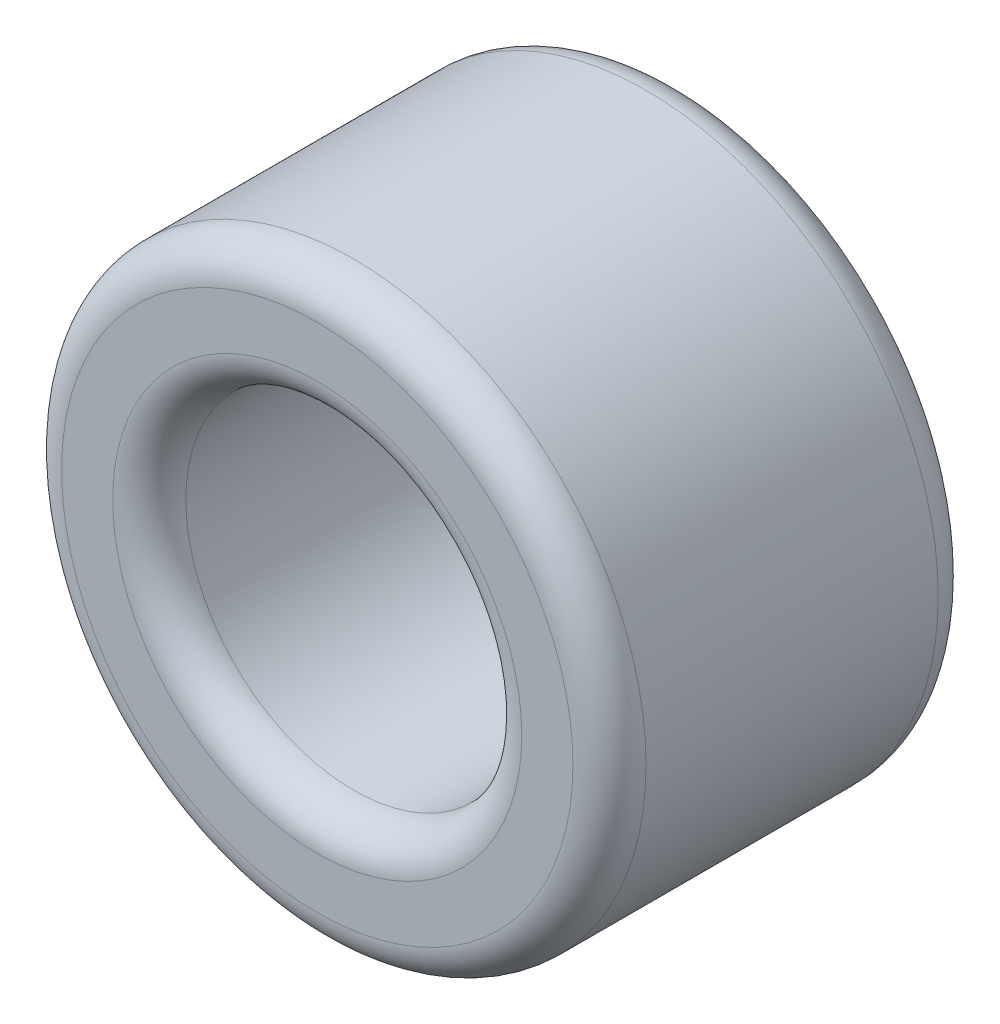
ISO-10303-21;
HEADER;
FILE_DESCRIPTION(('STEP AP214'),'2;1');
FILE_NAME('part.step','',(''),(''),'','','');
FILE_SCHEMA(('AUTOMOTIVE_DESIGN { 1 0 10303 214 1 1 1 1 }'));
ENDSEC;
DATA;
#1=APPLICATION_CONTEXT('core data for automotive mechanical design processes');
#2=APPLICATION_PROTOCOL_DEFINITION('international standard','automotive_design',2000,#1);
#3=PRODUCT_CONTEXT('',#1,'mechanical');
#4=PRODUCT('Part','Part','',(#3));
#5=PRODUCT_RELATED_PRODUCT_CATEGORY('part','',(#4));
#6=PRODUCT_DEFINITION_FORMATION('','',#4);
#7=PRODUCT_DEFINITION_CONTEXT('part definition',#1,'design');
#8=PRODUCT_DEFINITION('design','',#6,#7);
#9=PRODUCT_DEFINITION_SHAPE('','',#8);
#10=(LENGTH_UNIT() NAMED_UNIT(*) SI_UNIT(.MILLI.,.METRE.));
#11=(NAMED_UNIT(*) PLANE_ANGLE_UNIT() SI_UNIT($,.RADIAN.));
#12=(NAMED_UNIT(*) SI_UNIT($,.STERADIAN.) SOLID_ANGLE_UNIT());
#13=UNCERTAINTY_MEASURE_WITH_UNIT(LENGTH_MEASURE(1.E-05),#10,'distance_accuracy_value','');
#14=(GEOMETRIC_REPRESENTATION_CONTEXT(3) GLOBAL_UNCERTAINTY_ASSIGNED_CONTEXT((#13)) GLOBAL_UNIT_ASSIGNED_CONTEXT((#10,
#11,#12)) REPRESENTATION_CONTEXT('',''));
#15=CARTESIAN_POINT('',(0.,0.,0.));
#16=DIRECTION('',(0.,0.,1.));
#17=DIRECTION('',(1.,0.,0.));
#18=AXIS2_PLACEMENT_3D('',#15,#16,#17);
#19=CARTESIAN_POINT('',(0.,0.,5.));
#20=DIRECTION('',(0.,0.,1.));
#21=DIRECTION('',(1.,0.,0.));
#22=AXIS2_PLACEMENT_3D('',#19,#20,#21);
#23=PLANE('',#22);
#24=CARTESIAN_POINT('',(0.,0.,5.));
#25=DIRECTION('',(0.,0.,1.));
#26=DIRECTION('',(1.,0.,0.));
#27=AXIS2_PLACEMENT_3D('',#24,#25,#26);
#28=CIRCLE('',#27,2.8);
#29=CARTESIAN_POINT('',(2.8,0.,5.));
#30=VERTEX_POINT('',#29);
#31=EDGE_CURVE('E10',#30,#30,#28,.F.);
#32=ORIENTED_EDGE('',*,*,#31,.T.);
#33=EDGE_LOOP('',(#32));
#34=FACE_BOUND('',#33,.T.);
#35=CARTESIAN_POINT('',(0.,0.,5.));
#36=DIRECTION('',(0.,0.,1.));
#37=DIRECTION('',(1.,0.,0.));
#38=AXIS2_PLACEMENT_3D('',#35,#36,#37);
#39=CIRCLE('',#38,3.5);
#40=CARTESIAN_POINT('',(3.5,0.,5.));
#41=VERTEX_POINT('',#40);
#42=EDGE_CURVE('E44',#41,#41,#39,.T.);
#43=ORIENTED_EDGE('',*,*,#42,.T.);
#44=EDGE_LOOP('',(#43));
#45=FACE_BOUND('',#44,.T.);
#46=ADVANCED_FACE('F37',(#34,#45),#23,.T.);
#47=CARTESIAN_POINT('',(0.,0.,0.));
#48=DIRECTION('',(0.,0.,1.));
#49=DIRECTION('',(1.,0.,0.));
#50=AXIS2_PLACEMENT_3D('',#47,#48,#49);
#51=PLANE('',#50);
#52=CARTESIAN_POINT('',(0.,0.,0.));
#53=DIRECTION('',(0.,0.,1.));
#54=DIRECTION('',(1.,0.,0.));
#55=AXIS2_PLACEMENT_3D('',#52,#53,#54);
#56=CIRCLE('',#55,2.8);
#57=CARTESIAN_POINT('',(2.8,0.,0.));
#58=VERTEX_POINT('',#57);
#59=EDGE_CURVE('E63',#58,#58,#56,.T.);
#60=ORIENTED_EDGE('',*,*,#59,.T.);
#61=EDGE_LOOP('',(#60));
#62=FACE_BOUND('',#61,.T.);
#63=CARTESIAN_POINT('',(0.,0.,0.));
#64=DIRECTION('',(0.,0.,1.));
#65=DIRECTION('',(1.,0.,0.));
#66=AXIS2_PLACEMENT_3D('',#63,#64,#65);
#67=CIRCLE('',#66,3.5);
#68=CARTESIAN_POINT('',(3.5,0.,0.));
#69=VERTEX_POINT('',#68);
#70=EDGE_CURVE('E66',#69,#69,#67,.F.);
#71=ORIENTED_EDGE('',*,*,#70,.T.);
#72=EDGE_LOOP('',(#71));
#73=FACE_BOUND('',#72,.T.);
#74=ADVANCED_FACE('F70',(#62,#73),#51,.F.);
#75=CARTESIAN_POINT('',(0.,0.,5.));
#76=DIRECTION('',(0.,0.,-1.));
#77=DIRECTION('',(-1.,0.,0.));
#78=AXIS2_PLACEMENT_3D('',#75,#76,#77);
#79=CYLINDRICAL_SURFACE('',#78,4.);
#80=CARTESIAN_POINT('',(0.,0.,0.5));
#81=DIRECTION('',(0.,0.,1.));
#82=DIRECTION('',(1.,0.,0.));
#83=AXIS2_PLACEMENT_3D('',#80,#81,#82);
#84=CIRCLE('',#83,4.);
#85=CARTESIAN_POINT('',(4.,0.,0.5));
#86=VERTEX_POINT('',#85);
#87=EDGE_CURVE('E48',#86,#86,#84,.T.);
#88=ORIENTED_EDGE('',*,*,#87,.T.);
#89=EDGE_LOOP('',(#88));
#90=FACE_BOUND('',#89,.T.);
#91=CARTESIAN_POINT('',(0.,0.,4.5));
#92=DIRECTION('',(0.,0.,1.));
#93=DIRECTION('',(1.,0.,0.));
#94=AXIS2_PLACEMENT_3D('',#91,#92,#93);
#95=CIRCLE('',#94,4.);
#96=CARTESIAN_POINT('',(4.,0.,4.5));
#97=VERTEX_POINT('',#96);
#98=EDGE_CURVE('E52',#97,#97,#95,.F.);
#99=ORIENTED_EDGE('',*,*,#98,.T.);
#100=EDGE_LOOP('',(#99));
#101=FACE_BOUND('',#100,.T.);
#102=ADVANCED_FACE('F80',(#90,#101),#79,.T.);
#103=CARTESIAN_POINT('',(0.,0.,5.));
#104=DIRECTION('',(0.,0.,-1.));
#105=DIRECTION('',(-1.,0.,0.));
#106=AXIS2_PLACEMENT_3D('',#103,#104,#105);
#107=CYLINDRICAL_SURFACE('',#106,2.3);
#108=CARTESIAN_POINT('',(0.,0.,0.5));
#109=DIRECTION('',(0.,0.,1.));
#110=DIRECTION('',(1.,0.,0.));
#111=AXIS2_PLACEMENT_3D('',#108,#109,#110);
#112=CIRCLE('',#111,2.3);
#113=CARTESIAN_POINT('',(2.3,0.,0.5));
#114=VERTEX_POINT('',#113);
#115=EDGE_CURVE('E57',#114,#114,#112,.F.);
#116=ORIENTED_EDGE('',*,*,#115,.T.);
#117=EDGE_LOOP('',(#116));
#118=FACE_BOUND('',#117,.T.);
#119=CARTESIAN_POINT('',(0.,0.,4.5));
#120=DIRECTION('',(0.,0.,1.));
#121=DIRECTION('',(1.,0.,0.));
#122=AXIS2_PLACEMENT_3D('',#119,#120,#121);
#123=CIRCLE('',#122,2.3);
#124=CARTESIAN_POINT('',(2.3,0.,4.5));
#125=VERTEX_POINT('',#124);
#126=EDGE_CURVE('E60',#125,#125,#123,.T.);
#127=ORIENTED_EDGE('',*,*,#126,.T.);
#128=EDGE_LOOP('',(#127));
#129=FACE_BOUND('',#128,.T.);
#130=ADVANCED_FACE('F83',(#118,#129),#107,.F.);
#131=CARTESIAN_POINT('',(0.,0.,0.5));
#132=DIRECTION('',(0.,0.,1.));
#133=DIRECTION('',(1.,0.,0.));
#134=AXIS2_PLACEMENT_3D('',#131,#132,#133);
#135=TOROIDAL_SURFACE('',#134,2.8,0.5);
#136=ORIENTED_EDGE('',*,*,#115,.F.);
#137=EDGE_LOOP('',(#136));
#138=FACE_BOUND('',#137,.T.);
#139=ORIENTED_EDGE('',*,*,#59,.F.);
#140=EDGE_LOOP('',(#139));
#141=FACE_BOUND('',#140,.T.);
#142=ADVANCED_FACE('F76',(#138,#141),#135,.T.);
#143=CARTESIAN_POINT('',(0.,0.,0.5));
#144=DIRECTION('',(0.,0.,1.));
#145=DIRECTION('',(1.,0.,0.));
#146=AXIS2_PLACEMENT_3D('',#143,#144,#145);
#147=TOROIDAL_SURFACE('',#146,3.5,0.5);
#148=ORIENTED_EDGE('',*,*,#70,.F.);
#149=EDGE_LOOP('',(#148));
#150=FACE_BOUND('',#149,.T.);
#151=ORIENTED_EDGE('',*,*,#87,.F.);
#152=EDGE_LOOP('',(#151));
#153=FACE_BOUND('',#152,.T.);
#154=ADVANCED_FACE('F72',(#150,#153),#147,.T.);
#155=CARTESIAN_POINT('',(0.,0.,4.5));
#156=DIRECTION('',(0.,0.,1.));
#157=DIRECTION('',(1.,0.,0.));
#158=AXIS2_PLACEMENT_3D('',#155,#156,#157);
#159=TOROIDAL_SURFACE('',#158,2.8,0.5);
#160=ORIENTED_EDGE('',*,*,#31,.F.);
#161=EDGE_LOOP('',(#160));
#162=FACE_BOUND('',#161,.T.);
#163=ORIENTED_EDGE('',*,*,#126,.F.);
#164=EDGE_LOOP('',(#163));
#165=FACE_BOUND('',#164,.T.);
#166=ADVANCED_FACE('F75',(#162,#165),#159,.T.);
#167=CARTESIAN_POINT('',(0.,0.,4.5));
#168=DIRECTION('',(0.,0.,1.));
#169=DIRECTION('',(1.,0.,0.));
#170=AXIS2_PLACEMENT_3D('',#167,#168,#169);
#171=TOROIDAL_SURFACE('',#170,3.5,0.5);
#172=ORIENTED_EDGE('',*,*,#98,.F.);
#173=EDGE_LOOP('',(#172));
#174=FACE_BOUND('',#173,.T.);
#175=ORIENTED_EDGE('',*,*,#42,.F.);
#176=EDGE_LOOP('',(#175));
#177=FACE_BOUND('',#176,.T.);
#178=ADVANCED_FACE('F39',(#174,#177),#171,.T.);
#179=CLOSED_SHELL('',(#46,#74,#102,#130,#142,#154,#166,#178));
#180=MANIFOLD_SOLID_BREP('B2',#179);
#181=ADVANCED_BREP_SHAPE_REPRESENTATION('',(#18,#180),#14);
#182=SHAPE_DEFINITION_REPRESENTATION(#9,#181);
ENDSEC;
END-ISO-10303-21;
